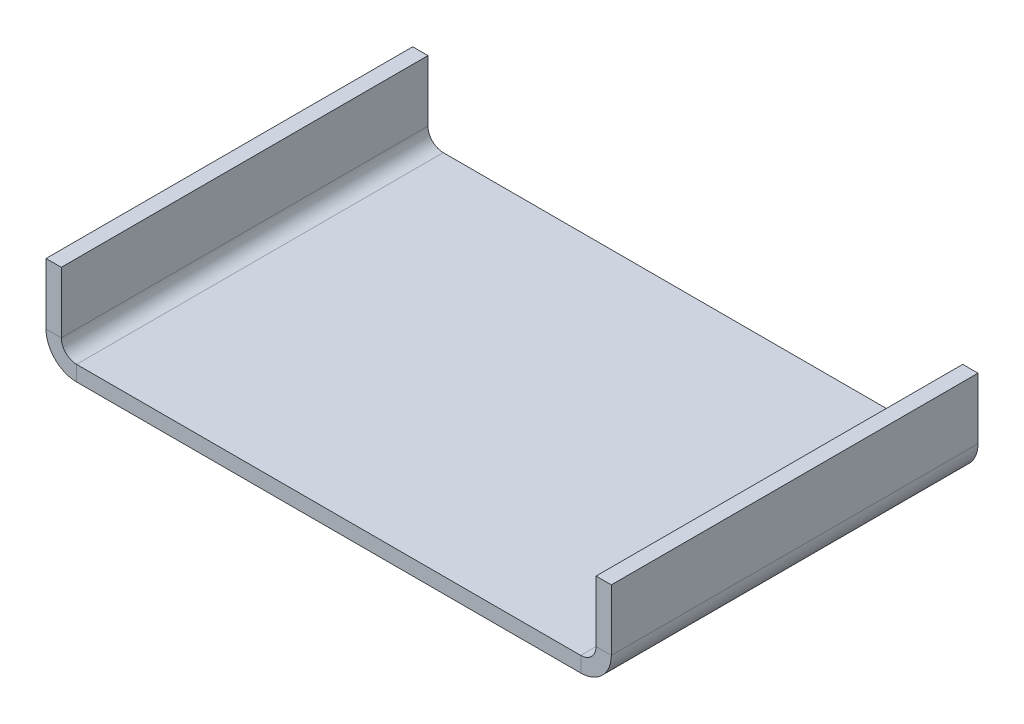
ISO-10303-21;
HEADER;
FILE_DESCRIPTION(('STEP AP214'),'2;1');
FILE_NAME('part.step','',(''),(''),'','','');
FILE_SCHEMA(('AUTOMOTIVE_DESIGN { 1 0 10303 214 1 1 1 1 }'));
ENDSEC;
DATA;
#1=APPLICATION_CONTEXT('core data for automotive mechanical design processes');
#2=APPLICATION_PROTOCOL_DEFINITION('international standard','automotive_design',2000,#1);
#3=PRODUCT_CONTEXT('',#1,'mechanical');
#4=PRODUCT('Part','Part','',(#3));
#5=PRODUCT_RELATED_PRODUCT_CATEGORY('part','',(#4));
#6=PRODUCT_DEFINITION_FORMATION('','',#4);
#7=PRODUCT_DEFINITION_CONTEXT('part definition',#1,'design');
#8=PRODUCT_DEFINITION('design','',#6,#7);
#9=PRODUCT_DEFINITION_SHAPE('','',#8);
#10=(LENGTH_UNIT() NAMED_UNIT(*) SI_UNIT(.MILLI.,.METRE.));
#11=(NAMED_UNIT(*) PLANE_ANGLE_UNIT() SI_UNIT($,.RADIAN.));
#12=(NAMED_UNIT(*) SI_UNIT($,.STERADIAN.) SOLID_ANGLE_UNIT());
#13=UNCERTAINTY_MEASURE_WITH_UNIT(LENGTH_MEASURE(1.E-05),#10,'distance_accuracy_value','');
#14=(GEOMETRIC_REPRESENTATION_CONTEXT(3) GLOBAL_UNCERTAINTY_ASSIGNED_CONTEXT((#13)) GLOBAL_UNIT_ASSIGNED_CONTEXT((#10,
#11,#12)) REPRESENTATION_CONTEXT('',''));
#15=CARTESIAN_POINT('',(0.,0.,0.));
#16=DIRECTION('',(0.,0.,1.));
#17=DIRECTION('',(1.,0.,0.));
#18=AXIS2_PLACEMENT_3D('',#15,#16,#17);
#19=CARTESIAN_POINT('',(0.,6.35,76.2));
#20=DIRECTION('',(0.,0.,1.));
#21=DIRECTION('',(1.,0.,0.));
#22=AXIS2_PLACEMENT_3D('',#19,#20,#21);
#23=PLANE('',#22);
#24=DIRECTION('',(1.,0.,0.));
#25=VECTOR('',#24,1.);
#26=CARTESIAN_POINT('',(0.,6.35,76.2));
#27=LINE('',#26,#25);
#28=CARTESIAN_POINT('',(0.,6.35,76.2));
#29=VERTEX_POINT('',#28);
#30=CARTESIAN_POINT('',(3.175,6.35,76.2));
#31=VERTEX_POINT('',#30);
#32=EDGE_CURVE('E11',#29,#31,#27,.T.);
#33=ORIENTED_EDGE('',*,*,#32,.F.);
#34=CARTESIAN_POINT('',(6.35,6.35,76.2));
#35=DIRECTION('',(0.,0.,-1.));
#36=DIRECTION('',(-1.,0.,0.));
#37=AXIS2_PLACEMENT_3D('',#34,#35,#36);
#38=CIRCLE('',#37,6.35);
#39=CARTESIAN_POINT('',(6.35,0.,76.2));
#40=VERTEX_POINT('',#39);
#41=EDGE_CURVE('E147',#29,#40,#38,.F.);
#42=ORIENTED_EDGE('',*,*,#41,.T.);
#43=DIRECTION('',(0.,-1.,0.));
#44=VECTOR('',#43,1.);
#45=CARTESIAN_POINT('',(6.35,3.175,76.2));
#46=LINE('',#45,#44);
#47=CARTESIAN_POINT('',(6.35,3.175,76.2));
#48=VERTEX_POINT('',#47);
#49=EDGE_CURVE('E45',#48,#40,#46,.T.);
#50=ORIENTED_EDGE('',*,*,#49,.F.);
#51=CARTESIAN_POINT('',(6.35,6.35,76.2));
#52=DIRECTION('',(0.,0.,1.));
#53=DIRECTION('',(1.,0.,0.));
#54=AXIS2_PLACEMENT_3D('',#51,#52,#53);
#55=CIRCLE('',#54,3.175);
#56=EDGE_CURVE('E241',#31,#48,#55,.T.);
#57=ORIENTED_EDGE('',*,*,#56,.F.);
#58=EDGE_LOOP('',(#33,#42,#50,#57));
#59=FACE_BOUND('',#58,.T.);
#60=ADVANCED_FACE('F37',(#59),#23,.T.);
#61=CARTESIAN_POINT('',(6.35,3.175,76.2));
#62=DIRECTION('',(0.,0.,1.));
#63=DIRECTION('',(1.,0.,0.));
#64=AXIS2_PLACEMENT_3D('',#61,#62,#63);
#65=PLANE('',#64);
#66=DIRECTION('',(0.,-1.,0.));
#67=VECTOR('',#66,1.);
#68=CARTESIAN_POINT('',(0.,0.,76.2));
#69=LINE('',#68,#67);
#70=CARTESIAN_POINT('',(0.,19.05,76.2));
#71=VERTEX_POINT('',#70);
#72=EDGE_CURVE('E152',#71,#29,#69,.T.);
#73=ORIENTED_EDGE('',*,*,#72,.T.);
#74=ORIENTED_EDGE('',*,*,#32,.T.);
#75=DIRECTION('',(0.,1.,0.));
#76=VECTOR('',#75,1.);
#77=CARTESIAN_POINT('',(3.175,0.,76.2));
#78=LINE('',#77,#76);
#79=CARTESIAN_POINT('',(3.175,19.05,76.2));
#80=VERTEX_POINT('',#79);
#81=EDGE_CURVE('E254',#80,#31,#78,.F.);
#82=ORIENTED_EDGE('',*,*,#81,.F.);
#83=DIRECTION('',(1.,0.,0.));
#84=VECTOR('',#83,1.);
#85=CARTESIAN_POINT('',(0.,19.05,76.2));
#86=LINE('',#85,#84);
#87=EDGE_CURVE('E256',#71,#80,#86,.T.);
#88=ORIENTED_EDGE('',*,*,#87,.F.);
#89=EDGE_LOOP('',(#73,#74,#82,#88));
#90=FACE_BOUND('',#89,.T.);
#91=ADVANCED_FACE('F267',(#90),#65,.T.);
#92=CARTESIAN_POINT('',(6.35,0.,0.));
#93=DIRECTION('',(0.,0.,-1.));
#94=DIRECTION('',(-1.,0.,0.));
#95=AXIS2_PLACEMENT_3D('',#92,#93,#94);
#96=PLANE('',#95);
#97=DIRECTION('',(0.,1.,0.));
#98=VECTOR('',#97,1.);
#99=CARTESIAN_POINT('',(6.35,0.,0.));
#100=LINE('',#99,#98);
#101=CARTESIAN_POINT('',(6.35,0.,0.));
#102=VERTEX_POINT('',#101);
#103=CARTESIAN_POINT('',(6.35,3.175,0.));
#104=VERTEX_POINT('',#103);
#105=EDGE_CURVE('E145',#102,#104,#100,.T.);
#106=ORIENTED_EDGE('',*,*,#105,.F.);
#107=CARTESIAN_POINT('',(6.35,6.35,0.));
#108=DIRECTION('',(0.,0.,-1.));
#109=DIRECTION('',(-1.,0.,0.));
#110=AXIS2_PLACEMENT_3D('',#107,#108,#109);
#111=CIRCLE('',#110,6.35);
#112=CARTESIAN_POINT('',(0.,6.35,0.));
#113=VERTEX_POINT('',#112);
#114=EDGE_CURVE('E159',#113,#102,#111,.F.);
#115=ORIENTED_EDGE('',*,*,#114,.F.);
#116=DIRECTION('',(-1.,0.,0.));
#117=VECTOR('',#116,1.);
#118=CARTESIAN_POINT('',(3.175,6.35,0.));
#119=LINE('',#118,#117);
#120=CARTESIAN_POINT('',(3.175,6.35,0.));
#121=VERTEX_POINT('',#120);
#122=EDGE_CURVE('E232',#121,#113,#119,.T.);
#123=ORIENTED_EDGE('',*,*,#122,.F.);
#124=CARTESIAN_POINT('',(6.35,6.35,0.));
#125=DIRECTION('',(0.,0.,1.));
#126=DIRECTION('',(1.,0.,0.));
#127=AXIS2_PLACEMENT_3D('',#124,#125,#126);
#128=CIRCLE('',#127,3.175);
#129=EDGE_CURVE('E186',#121,#104,#128,.T.);
#130=ORIENTED_EDGE('',*,*,#129,.T.);
#131=EDGE_LOOP('',(#106,#115,#123,#130));
#132=FACE_BOUND('',#131,.T.);
#133=ADVANCED_FACE('F246',(#132),#96,.T.);
#134=CARTESIAN_POINT('',(3.175,6.35,0.));
#135=DIRECTION('',(0.,0.,-1.));
#136=DIRECTION('',(-1.,0.,0.));
#137=AXIS2_PLACEMENT_3D('',#134,#135,#136);
#138=PLANE('',#137);
#139=DIRECTION('',(1.,0.,0.));
#140=VECTOR('',#139,1.);
#141=CARTESIAN_POINT('',(0.,0.,0.));
#142=LINE('',#141,#140);
#143=CARTESIAN_POINT('',(111.125,0.,0.));
#144=VERTEX_POINT('',#143);
#145=EDGE_CURVE('E199',#102,#144,#142,.T.);
#146=ORIENTED_EDGE('',*,*,#145,.F.);
#147=ORIENTED_EDGE('',*,*,#105,.T.);
#148=DIRECTION('',(1.,0.,0.));
#149=VECTOR('',#148,1.);
#150=CARTESIAN_POINT('',(0.,3.175,0.));
#151=LINE('',#150,#149);
#152=CARTESIAN_POINT('',(111.125,3.175,0.));
#153=VERTEX_POINT('',#152);
#154=EDGE_CURVE('E184',#104,#153,#151,.T.);
#155=ORIENTED_EDGE('',*,*,#154,.T.);
#156=DIRECTION('',(0.,-1.,0.));
#157=VECTOR('',#156,1.);
#158=CARTESIAN_POINT('',(111.125,3.175,0.));
#159=LINE('',#158,#157);
#160=EDGE_CURVE('E94',#153,#144,#159,.T.);
#161=ORIENTED_EDGE('',*,*,#160,.T.);
#162=EDGE_LOOP('',(#146,#147,#155,#161));
#163=FACE_BOUND('',#162,.T.);
#164=ADVANCED_FACE('F234',(#163),#138,.T.);
#165=CARTESIAN_POINT('',(111.125,0.,76.2));
#166=DIRECTION('',(0.,0.,1.));
#167=DIRECTION('',(1.,0.,0.));
#168=AXIS2_PLACEMENT_3D('',#165,#166,#167);
#169=PLANE('',#168);
#170=DIRECTION('',(0.,1.,0.));
#171=VECTOR('',#170,1.);
#172=CARTESIAN_POINT('',(111.125,0.,76.2));
#173=LINE('',#172,#171);
#174=CARTESIAN_POINT('',(111.125,0.,76.2));
#175=VERTEX_POINT('',#174);
#176=CARTESIAN_POINT('',(111.125,3.175,76.2));
#177=VERTEX_POINT('',#176);
#178=EDGE_CURVE('E230',#175,#177,#173,.T.);
#179=ORIENTED_EDGE('',*,*,#178,.F.);
#180=CARTESIAN_POINT('',(111.125,6.35,76.2));
#181=DIRECTION('',(0.,0.,-1.));
#182=DIRECTION('',(-1.,0.,0.));
#183=AXIS2_PLACEMENT_3D('',#180,#181,#182);
#184=CIRCLE('',#183,6.35);
#185=CARTESIAN_POINT('',(117.475,6.35,76.2));
#186=VERTEX_POINT('',#185);
#187=EDGE_CURVE('E167',#175,#186,#184,.F.);
#188=ORIENTED_EDGE('',*,*,#187,.T.);
#189=DIRECTION('',(1.,0.,0.));
#190=VECTOR('',#189,1.);
#191=CARTESIAN_POINT('',(114.3,6.35,76.2));
#192=LINE('',#191,#190);
#193=CARTESIAN_POINT('',(114.3,6.35,76.2));
#194=VERTEX_POINT('',#193);
#195=EDGE_CURVE('E53',#194,#186,#192,.T.);
#196=ORIENTED_EDGE('',*,*,#195,.F.);
#197=CARTESIAN_POINT('',(111.125,6.35,76.2));
#198=DIRECTION('',(0.,0.,1.));
#199=DIRECTION('',(1.,0.,0.));
#200=AXIS2_PLACEMENT_3D('',#197,#198,#199);
#201=CIRCLE('',#200,3.175);
#202=EDGE_CURVE('E258',#177,#194,#201,.T.);
#203=ORIENTED_EDGE('',*,*,#202,.F.);
#204=EDGE_LOOP('',(#179,#188,#196,#203));
#205=FACE_BOUND('',#204,.T.);
#206=ADVANCED_FACE('F293',(#205),#169,.T.);
#207=CARTESIAN_POINT('',(114.3,6.35,76.2));
#208=DIRECTION('',(0.,0.,1.));
#209=DIRECTION('',(1.,0.,0.));
#210=AXIS2_PLACEMENT_3D('',#207,#208,#209);
#211=PLANE('',#210);
#212=DIRECTION('',(1.,0.,0.));
#213=VECTOR('',#212,1.);
#214=CARTESIAN_POINT('',(0.,0.,76.2));
#215=LINE('',#214,#213);
#216=EDGE_CURVE('E137',#40,#175,#215,.T.);
#217=ORIENTED_EDGE('',*,*,#216,.T.);
#218=ORIENTED_EDGE('',*,*,#178,.T.);
#219=DIRECTION('',(1.,0.,0.));
#220=VECTOR('',#219,1.);
#221=CARTESIAN_POINT('',(0.,3.175,76.2));
#222=LINE('',#221,#220);
#223=EDGE_CURVE('E140',#48,#177,#222,.T.);
#224=ORIENTED_EDGE('',*,*,#223,.F.);
#225=ORIENTED_EDGE('',*,*,#49,.T.);
#226=EDGE_LOOP('',(#217,#218,#224,#225));
#227=FACE_BOUND('',#226,.T.);
#228=ADVANCED_FACE('F135',(#227),#211,.T.);
#229=CARTESIAN_POINT('',(117.475,6.35,0.));
#230=DIRECTION('',(0.,0.,-1.));
#231=DIRECTION('',(-1.,0.,0.));
#232=AXIS2_PLACEMENT_3D('',#229,#230,#231);
#233=PLANE('',#232);
#234=DIRECTION('',(-1.,0.,0.));
#235=VECTOR('',#234,1.);
#236=CARTESIAN_POINT('',(117.475,6.35,0.));
#237=LINE('',#236,#235);
#238=CARTESIAN_POINT('',(117.475,6.35,0.));
#239=VERTEX_POINT('',#238);
#240=CARTESIAN_POINT('',(114.3,6.35,0.));
#241=VERTEX_POINT('',#240);
#242=EDGE_CURVE('E101',#239,#241,#237,.T.);
#243=ORIENTED_EDGE('',*,*,#242,.F.);
#244=CARTESIAN_POINT('',(111.125,6.35,0.));
#245=DIRECTION('',(0.,0.,-1.));
#246=DIRECTION('',(-1.,0.,0.));
#247=AXIS2_PLACEMENT_3D('',#244,#245,#246);
#248=CIRCLE('',#247,6.35);
#249=EDGE_CURVE('E201',#144,#239,#248,.F.);
#250=ORIENTED_EDGE('',*,*,#249,.F.);
#251=ORIENTED_EDGE('',*,*,#160,.F.);
#252=CARTESIAN_POINT('',(111.125,6.35,0.));
#253=DIRECTION('',(0.,0.,1.));
#254=DIRECTION('',(1.,0.,0.));
#255=AXIS2_PLACEMENT_3D('',#252,#253,#254);
#256=CIRCLE('',#255,3.175);
#257=EDGE_CURVE('E182',#153,#241,#256,.T.);
#258=ORIENTED_EDGE('',*,*,#257,.T.);
#259=EDGE_LOOP('',(#243,#250,#251,#258));
#260=FACE_BOUND('',#259,.T.);
#261=ADVANCED_FACE('F299',(#260),#233,.T.);
#262=CARTESIAN_POINT('',(111.125,3.175,0.));
#263=DIRECTION('',(0.,0.,-1.));
#264=DIRECTION('',(-1.,0.,0.));
#265=AXIS2_PLACEMENT_3D('',#262,#263,#264);
#266=PLANE('',#265);
#267=DIRECTION('',(0.,1.,0.));
#268=VECTOR('',#267,1.);
#269=CARTESIAN_POINT('',(117.475,0.,0.));
#270=LINE('',#269,#268);
#271=CARTESIAN_POINT('',(117.475,19.05,0.));
#272=VERTEX_POINT('',#271);
#273=EDGE_CURVE('E173',#239,#272,#270,.T.);
#274=ORIENTED_EDGE('',*,*,#273,.F.);
#275=ORIENTED_EDGE('',*,*,#242,.T.);
#276=DIRECTION('',(0.,1.,0.));
#277=VECTOR('',#276,1.);
#278=CARTESIAN_POINT('',(114.3,0.,0.));
#279=LINE('',#278,#277);
#280=CARTESIAN_POINT('',(114.3,19.05,0.));
#281=VERTEX_POINT('',#280);
#282=EDGE_CURVE('E179',#241,#281,#279,.T.);
#283=ORIENTED_EDGE('',*,*,#282,.T.);
#284=DIRECTION('',(1.,0.,0.));
#285=VECTOR('',#284,1.);
#286=CARTESIAN_POINT('',(114.3,19.05,0.));
#287=LINE('',#286,#285);
#288=EDGE_CURVE('E176',#281,#272,#287,.T.);
#289=ORIENTED_EDGE('',*,*,#288,.T.);
#290=EDGE_LOOP('',(#274,#275,#283,#289));
#291=FACE_BOUND('',#290,.T.);
#292=ADVANCED_FACE('F302',(#291),#266,.T.);
#293=CARTESIAN_POINT('',(117.475,0.,76.2));
#294=DIRECTION('',(-1.,0.,0.));
#295=DIRECTION('',(0.,0.,1.));
#296=AXIS2_PLACEMENT_3D('',#293,#294,#295);
#297=PLANE('',#296);
#298=ORIENTED_EDGE('',*,*,#273,.T.);
#299=DIRECTION('',(0.,0.,-1.));
#300=VECTOR('',#299,1.);
#301=CARTESIAN_POINT('',(117.475,19.05,76.2));
#302=LINE('',#301,#300);
#303=CARTESIAN_POINT('',(117.475,19.05,76.2));
#304=VERTEX_POINT('',#303);
#305=EDGE_CURVE('E225',#304,#272,#302,.T.);
#306=ORIENTED_EDGE('',*,*,#305,.F.);
#307=DIRECTION('',(0.,1.,0.));
#308=VECTOR('',#307,1.);
#309=CARTESIAN_POINT('',(117.475,0.,76.2));
#310=LINE('',#309,#308);
#311=EDGE_CURVE('E107',#186,#304,#310,.T.);
#312=ORIENTED_EDGE('',*,*,#311,.F.);
#313=DIRECTION('',(0.,0.,-1.));
#314=VECTOR('',#313,1.);
#315=CARTESIAN_POINT('',(117.475,6.35,76.2));
#316=LINE('',#315,#314);
#317=EDGE_CURVE('E169',#186,#239,#316,.T.);
#318=ORIENTED_EDGE('',*,*,#317,.T.);
#319=EDGE_LOOP('',(#298,#306,#312,#318));
#320=FACE_BOUND('',#319,.T.);
#321=ADVANCED_FACE('F305',(#320),#297,.F.);
#322=CARTESIAN_POINT('',(114.3,19.05,76.2));
#323=DIRECTION('',(0.,1.,0.));
#324=DIRECTION('',(0.,0.,1.));
#325=AXIS2_PLACEMENT_3D('',#322,#323,#324);
#326=PLANE('',#325);
#327=ORIENTED_EDGE('',*,*,#288,.F.);
#328=DIRECTION('',(0.,0.,-1.));
#329=VECTOR('',#328,1.);
#330=CARTESIAN_POINT('',(114.3,19.05,76.2));
#331=LINE('',#330,#329);
#332=CARTESIAN_POINT('',(114.3,19.05,76.2));
#333=VERTEX_POINT('',#332);
#334=EDGE_CURVE('E223',#333,#281,#331,.T.);
#335=ORIENTED_EDGE('',*,*,#334,.F.);
#336=DIRECTION('',(1.,0.,0.));
#337=VECTOR('',#336,1.);
#338=CARTESIAN_POINT('',(114.3,19.05,76.2));
#339=LINE('',#338,#337);
#340=EDGE_CURVE('E513',#333,#304,#339,.T.);
#341=ORIENTED_EDGE('',*,*,#340,.T.);
#342=ORIENTED_EDGE('',*,*,#305,.T.);
#343=EDGE_LOOP('',(#327,#335,#341,#342));
#344=FACE_BOUND('',#343,.T.);
#345=ADVANCED_FACE('F309',(#344),#326,.T.);
#346=CARTESIAN_POINT('',(114.3,0.,76.2));
#347=DIRECTION('',(-1.,0.,0.));
#348=DIRECTION('',(0.,0.,1.));
#349=AXIS2_PLACEMENT_3D('',#346,#347,#348);
#350=PLANE('',#349);
#351=ORIENTED_EDGE('',*,*,#282,.F.);
#352=DIRECTION('',(0.,0.,-1.));
#353=VECTOR('',#352,1.);
#354=CARTESIAN_POINT('',(114.3,6.35,76.2));
#355=LINE('',#354,#353);
#356=EDGE_CURVE('E220',#194,#241,#355,.T.);
#357=ORIENTED_EDGE('',*,*,#356,.F.);
#358=DIRECTION('',(0.,1.,0.));
#359=VECTOR('',#358,1.);
#360=CARTESIAN_POINT('',(114.3,0.,76.2));
#361=LINE('',#360,#359);
#362=EDGE_CURVE('E515',#194,#333,#361,.T.);
#363=ORIENTED_EDGE('',*,*,#362,.T.);
#364=ORIENTED_EDGE('',*,*,#334,.T.);
#365=EDGE_LOOP('',(#351,#357,#363,#364));
#366=FACE_BOUND('',#365,.T.);
#367=ADVANCED_FACE('F313',(#366),#350,.T.);
#368=CARTESIAN_POINT('',(111.125,6.35,76.2));
#369=DIRECTION('',(0.,0.,-1.));
#370=DIRECTION('',(-1.,0.,0.));
#371=AXIS2_PLACEMENT_3D('',#368,#369,#370);
#372=CYLINDRICAL_SURFACE('',#371,3.175);
#373=ORIENTED_EDGE('',*,*,#257,.F.);
#374=DIRECTION('',(0.,0.,-1.));
#375=VECTOR('',#374,1.);
#376=CARTESIAN_POINT('',(111.125,3.175,76.2));
#377=LINE('',#376,#375);
#378=EDGE_CURVE('E217',#177,#153,#377,.T.);
#379=ORIENTED_EDGE('',*,*,#378,.F.);
#380=ORIENTED_EDGE('',*,*,#202,.T.);
#381=ORIENTED_EDGE('',*,*,#356,.T.);
#382=EDGE_LOOP('',(#373,#379,#380,#381));
#383=FACE_BOUND('',#382,.T.);
#384=ADVANCED_FACE('F317',(#383),#372,.F.);
#385=CARTESIAN_POINT('',(0.,3.175,76.2));
#386=DIRECTION('',(0.,1.,0.));
#387=DIRECTION('',(0.,0.,1.));
#388=AXIS2_PLACEMENT_3D('',#385,#386,#387);
#389=PLANE('',#388);
#390=ORIENTED_EDGE('',*,*,#154,.F.);
#391=DIRECTION('',(0.,0.,-1.));
#392=VECTOR('',#391,1.);
#393=CARTESIAN_POINT('',(6.35,3.175,76.2));
#394=LINE('',#393,#392);
#395=EDGE_CURVE('E214',#48,#104,#394,.T.);
#396=ORIENTED_EDGE('',*,*,#395,.F.);
#397=ORIENTED_EDGE('',*,*,#223,.T.);
#398=ORIENTED_EDGE('',*,*,#378,.T.);
#399=EDGE_LOOP('',(#390,#396,#397,#398));
#400=FACE_BOUND('',#399,.T.);
#401=ADVANCED_FACE('F243',(#400),#389,.T.);
#402=CARTESIAN_POINT('',(6.35,6.35,76.2));
#403=DIRECTION('',(0.,0.,-1.));
#404=DIRECTION('',(-1.,0.,0.));
#405=AXIS2_PLACEMENT_3D('',#402,#403,#404);
#406=CYLINDRICAL_SURFACE('',#405,3.175);
#407=ORIENTED_EDGE('',*,*,#129,.F.);
#408=DIRECTION('',(0.,0.,-1.));
#409=VECTOR('',#408,1.);
#410=CARTESIAN_POINT('',(3.175,6.35,76.2));
#411=LINE('',#410,#409);
#412=EDGE_CURVE('E211',#31,#121,#411,.T.);
#413=ORIENTED_EDGE('',*,*,#412,.F.);
#414=ORIENTED_EDGE('',*,*,#56,.T.);
#415=ORIENTED_EDGE('',*,*,#395,.T.);
#416=EDGE_LOOP('',(#407,#413,#414,#415));
#417=FACE_BOUND('',#416,.T.);
#418=ADVANCED_FACE('F239',(#417),#406,.F.);
#419=CARTESIAN_POINT('',(3.175,0.,76.2));
#420=DIRECTION('',(1.,0.,0.));
#421=DIRECTION('',(0.,0.,-1.));
#422=AXIS2_PLACEMENT_3D('',#419,#420,#421);
#423=PLANE('',#422);
#424=DIRECTION('',(0.,1.,0.));
#425=VECTOR('',#424,1.);
#426=CARTESIAN_POINT('',(3.175,0.,0.));
#427=LINE('',#426,#425);
#428=CARTESIAN_POINT('',(3.175,19.05,0.));
#429=VERTEX_POINT('',#428);
#430=EDGE_CURVE('E189',#429,#121,#427,.F.);
#431=ORIENTED_EDGE('',*,*,#430,.F.);
#432=DIRECTION('',(0.,0.,-1.));
#433=VECTOR('',#432,1.);
#434=CARTESIAN_POINT('',(3.175,19.05,76.2));
#435=LINE('',#434,#433);
#436=EDGE_CURVE('E209',#80,#429,#435,.T.);
#437=ORIENTED_EDGE('',*,*,#436,.F.);
#438=ORIENTED_EDGE('',*,*,#81,.T.);
#439=ORIENTED_EDGE('',*,*,#412,.T.);
#440=EDGE_LOOP('',(#431,#437,#438,#439));
#441=FACE_BOUND('',#440,.T.);
#442=ADVANCED_FACE('F252',(#441),#423,.T.);
#443=CARTESIAN_POINT('',(0.,19.05,76.2));
#444=DIRECTION('',(0.,1.,0.));
#445=DIRECTION('',(0.,0.,1.));
#446=AXIS2_PLACEMENT_3D('',#443,#444,#445);
#447=PLANE('',#446);
#448=DIRECTION('',(1.,0.,0.));
#449=VECTOR('',#448,1.);
#450=CARTESIAN_POINT('',(0.,19.05,0.));
#451=LINE('',#450,#449);
#452=CARTESIAN_POINT('',(0.,19.05,0.));
#453=VERTEX_POINT('',#452);
#454=EDGE_CURVE('E192',#453,#429,#451,.T.);
#455=ORIENTED_EDGE('',*,*,#454,.F.);
#456=DIRECTION('',(0.,0.,-1.));
#457=VECTOR('',#456,1.);
#458=CARTESIAN_POINT('',(0.,19.05,76.2));
#459=LINE('',#458,#457);
#460=EDGE_CURVE('E207',#71,#453,#459,.T.);
#461=ORIENTED_EDGE('',*,*,#460,.F.);
#462=ORIENTED_EDGE('',*,*,#87,.T.);
#463=ORIENTED_EDGE('',*,*,#436,.T.);
#464=EDGE_LOOP('',(#455,#461,#462,#463));
#465=FACE_BOUND('',#464,.T.);
#466=ADVANCED_FACE('F273',(#465),#447,.T.);
#467=CARTESIAN_POINT('',(0.,0.,76.2));
#468=DIRECTION('',(1.,0.,0.));
#469=DIRECTION('',(0.,0.,-1.));
#470=AXIS2_PLACEMENT_3D('',#467,#468,#469);
#471=PLANE('',#470);
#472=DIRECTION('',(0.,-1.,0.));
#473=VECTOR('',#472,1.);
#474=CARTESIAN_POINT('',(0.,0.,0.));
#475=LINE('',#474,#473);
#476=EDGE_CURVE('E195',#453,#113,#475,.T.);
#477=ORIENTED_EDGE('',*,*,#476,.T.);
#478=DIRECTION('',(0.,0.,-1.));
#479=VECTOR('',#478,1.);
#480=CARTESIAN_POINT('',(0.,6.35,76.2));
#481=LINE('',#480,#479);
#482=EDGE_CURVE('E161',#29,#113,#481,.T.);
#483=ORIENTED_EDGE('',*,*,#482,.F.);
#484=ORIENTED_EDGE('',*,*,#72,.F.);
#485=ORIENTED_EDGE('',*,*,#460,.T.);
#486=EDGE_LOOP('',(#477,#483,#484,#485));
#487=FACE_BOUND('',#486,.T.);
#488=ADVANCED_FACE('F269',(#487),#471,.F.);
#489=CARTESIAN_POINT('',(6.35,6.35,76.2));
#490=DIRECTION('',(0.,0.,-1.));
#491=DIRECTION('',(-1.,0.,0.));
#492=AXIS2_PLACEMENT_3D('',#489,#490,#491);
#493=CYLINDRICAL_SURFACE('',#492,6.35);
#494=ORIENTED_EDGE('',*,*,#114,.T.);
#495=DIRECTION('',(0.,0.,-1.));
#496=VECTOR('',#495,1.);
#497=CARTESIAN_POINT('',(6.35,0.,76.2));
#498=LINE('',#497,#496);
#499=EDGE_CURVE('E156',#40,#102,#498,.T.);
#500=ORIENTED_EDGE('',*,*,#499,.F.);
#501=ORIENTED_EDGE('',*,*,#41,.F.);
#502=ORIENTED_EDGE('',*,*,#482,.T.);
#503=EDGE_LOOP('',(#494,#500,#501,#502));
#504=FACE_BOUND('',#503,.T.);
#505=ADVANCED_FACE('F157',(#504),#493,.T.);
#506=CARTESIAN_POINT('',(0.,0.,76.2));
#507=DIRECTION('',(0.,1.,0.));
#508=DIRECTION('',(0.,0.,1.));
#509=AXIS2_PLACEMENT_3D('',#506,#507,#508);
#510=PLANE('',#509);
#511=ORIENTED_EDGE('',*,*,#145,.T.);
#512=DIRECTION('',(0.,0.,-1.));
#513=VECTOR('',#512,1.);
#514=CARTESIAN_POINT('',(111.125,0.,76.2));
#515=LINE('',#514,#513);
#516=EDGE_CURVE('E162',#175,#144,#515,.T.);
#517=ORIENTED_EDGE('',*,*,#516,.F.);
#518=ORIENTED_EDGE('',*,*,#216,.F.);
#519=ORIENTED_EDGE('',*,*,#499,.T.);
#520=EDGE_LOOP('',(#511,#517,#518,#519));
#521=FACE_BOUND('',#520,.T.);
#522=ADVANCED_FACE('F164',(#521),#510,.F.);
#523=CARTESIAN_POINT('',(111.125,6.35,76.2));
#524=DIRECTION('',(0.,0.,-1.));
#525=DIRECTION('',(-1.,0.,0.));
#526=AXIS2_PLACEMENT_3D('',#523,#524,#525);
#527=CYLINDRICAL_SURFACE('',#526,6.35);
#528=ORIENTED_EDGE('',*,*,#249,.T.);
#529=ORIENTED_EDGE('',*,*,#317,.F.);
#530=ORIENTED_EDGE('',*,*,#187,.F.);
#531=ORIENTED_EDGE('',*,*,#516,.T.);
#532=EDGE_LOOP('',(#528,#529,#530,#531));
#533=FACE_BOUND('',#532,.T.);
#534=ADVANCED_FACE('F364',(#533),#527,.T.);
#535=CARTESIAN_POINT('',(111.125,6.35,76.2));
#536=DIRECTION('',(0.,0.,1.));
#537=DIRECTION('',(1.,0.,0.));
#538=AXIS2_PLACEMENT_3D('',#535,#536,#537);
#539=PLANE('',#538);
#540=ORIENTED_EDGE('',*,*,#311,.T.);
#541=ORIENTED_EDGE('',*,*,#340,.F.);
#542=ORIENTED_EDGE('',*,*,#362,.F.);
#543=ORIENTED_EDGE('',*,*,#195,.T.);
#544=EDGE_LOOP('',(#540,#541,#542,#543));
#545=FACE_BOUND('',#544,.T.);
#546=ADVANCED_FACE('F374',(#545),#539,.T.);
#547=CARTESIAN_POINT('',(111.125,6.35,0.));
#548=DIRECTION('',(0.,0.,1.));
#549=DIRECTION('',(1.,0.,0.));
#550=AXIS2_PLACEMENT_3D('',#547,#548,#549);
#551=PLANE('',#550);
#552=ORIENTED_EDGE('',*,*,#430,.T.);
#553=ORIENTED_EDGE('',*,*,#122,.T.);
#554=ORIENTED_EDGE('',*,*,#476,.F.);
#555=ORIENTED_EDGE('',*,*,#454,.T.);
#556=EDGE_LOOP('',(#552,#553,#554,#555));
#557=FACE_BOUND('',#556,.T.);
#558=ADVANCED_FACE('F271',(#557),#551,.F.);
#559=CLOSED_SHELL('',(#60,#91,#133,#164,#206,#228,#261,#292,#321,#345,#367,#384,#401,#418,#442,
#466,#488,#505,#522,#534,#546,#558));
#560=MANIFOLD_SOLID_BREP('B2',#559);
#561=ADVANCED_BREP_SHAPE_REPRESENTATION('',(#18,#560),#14);
#562=SHAPE_DEFINITION_REPRESENTATION(#9,#561);
ENDSEC;
END-ISO-10303-21;
